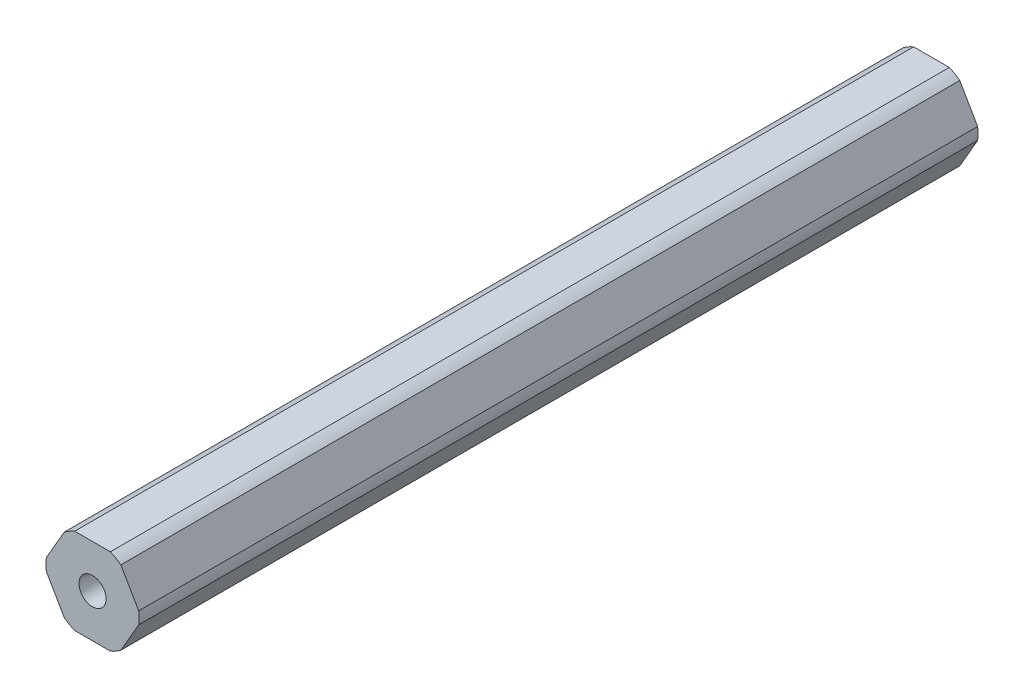
ISO-10303-21;
HEADER;
FILE_DESCRIPTION(('STEP AP214'),'2;1');
FILE_NAME('part.step','',(''),(''),'','','');
FILE_SCHEMA(('AUTOMOTIVE_DESIGN { 1 0 10303 214 1 1 1 1 }'));
ENDSEC;
DATA;
#1=APPLICATION_CONTEXT('core data for automotive mechanical design processes');
#2=APPLICATION_PROTOCOL_DEFINITION('international standard','automotive_design',2000,#1);
#3=PRODUCT_CONTEXT('',#1,'mechanical');
#4=PRODUCT('Part','Part','',(#3));
#5=PRODUCT_RELATED_PRODUCT_CATEGORY('part','',(#4));
#6=PRODUCT_DEFINITION_FORMATION('','',#4);
#7=PRODUCT_DEFINITION_CONTEXT('part definition',#1,'design');
#8=PRODUCT_DEFINITION('design','',#6,#7);
#9=PRODUCT_DEFINITION_SHAPE('','',#8);
#10=(LENGTH_UNIT() NAMED_UNIT(*) SI_UNIT(.MILLI.,.METRE.));
#11=(NAMED_UNIT(*) PLANE_ANGLE_UNIT() SI_UNIT($,.RADIAN.));
#12=(NAMED_UNIT(*) SI_UNIT($,.STERADIAN.) SOLID_ANGLE_UNIT());
#13=UNCERTAINTY_MEASURE_WITH_UNIT(LENGTH_MEASURE(1.E-05),#10,'distance_accuracy_value','');
#14=(GEOMETRIC_REPRESENTATION_CONTEXT(3) GLOBAL_UNCERTAINTY_ASSIGNED_CONTEXT((#13)) GLOBAL_UNIT_ASSIGNED_CONTEXT((#10,
#11,#12)) REPRESENTATION_CONTEXT('',''));
#15=CARTESIAN_POINT('',(0.,0.,0.));
#16=DIRECTION('',(0.,0.,1.));
#17=DIRECTION('',(1.,0.,0.));
#18=AXIS2_PLACEMENT_3D('',#15,#16,#17);
#19=CARTESIAN_POINT('',(5.49926131403118,3.175,61.9125));
#20=DIRECTION('',(-0.866025403784438,-0.5,0.));
#21=DIRECTION('',(0.5,-0.866025403784439,0.));
#22=AXIS2_PLACEMENT_3D('',#19,#20,#21);
#23=PLANE('',#22);
#24=DIRECTION('',(-0.5,0.866025403784439,0.));
#25=VECTOR('',#24,1.);
#26=CARTESIAN_POINT('',(5.49926131403118,3.175,-61.9125));
#27=LINE('',#26,#25);
#28=CARTESIAN_POINT('',(6.81675178197583,0.89303957103218,-61.9125));
#29=VERTEX_POINT('',#28);
#30=CARTESIAN_POINT('',(4.18177084608654,5.45696042896782,-61.9125));
#31=VERTEX_POINT('',#30);
#32=EDGE_CURVE('E164',#29,#31,#27,.T.);
#33=ORIENTED_EDGE('',*,*,#32,.T.);
#34=DIRECTION('',(0.,0.,-1.));
#35=VECTOR('',#34,1.);
#36=CARTESIAN_POINT('',(4.18177084608654,5.45696042896782,61.9125));
#37=LINE('',#36,#35);
#38=CARTESIAN_POINT('',(4.18177084608654,5.45696042896782,61.9125));
#39=VERTEX_POINT('',#38);
#40=EDGE_CURVE('E11',#39,#31,#37,.T.);
#41=ORIENTED_EDGE('',*,*,#40,.F.);
#42=DIRECTION('',(-0.5,0.866025403784439,0.));
#43=VECTOR('',#42,1.);
#44=CARTESIAN_POINT('',(5.49926131403118,3.175,61.9125));
#45=LINE('',#44,#43);
#46=CARTESIAN_POINT('',(6.81675178197583,0.89303957103218,61.9125));
#47=VERTEX_POINT('',#46);
#48=EDGE_CURVE('E223',#47,#39,#45,.T.);
#49=ORIENTED_EDGE('',*,*,#48,.F.);
#50=DIRECTION('',(0.,0.,-1.));
#51=VECTOR('',#50,1.);
#52=CARTESIAN_POINT('',(6.81675178197583,0.89303957103218,61.9125));
#53=LINE('',#52,#51);
#54=EDGE_CURVE('E157',#47,#29,#53,.T.);
#55=ORIENTED_EDGE('',*,*,#54,.T.);
#56=EDGE_LOOP('',(#33,#41,#49,#55));
#57=FACE_BOUND('',#56,.T.);
#58=ADVANCED_FACE('F39',(#57),#23,.F.);
#59=CARTESIAN_POINT('',(0.,0.,61.9125));
#60=DIRECTION('',(0.,0.,-1.));
#61=DIRECTION('',(-1.,0.,0.));
#62=AXIS2_PLACEMENT_3D('',#59,#60,#61);
#63=CYLINDRICAL_SURFACE('',#62,6.874999966);
#64=CARTESIAN_POINT('',(0.,0.,-61.9125));
#65=DIRECTION('',(0.,0.,1.));
#66=DIRECTION('',(1.,0.,0.));
#67=AXIS2_PLACEMENT_3D('',#64,#65,#66);
#68=CIRCLE('',#67,6.874999966);
#69=CARTESIAN_POINT('',(2.63498093588929,6.35,-61.9125));
#70=VERTEX_POINT('',#69);
#71=EDGE_CURVE('E167',#31,#70,#68,.T.);
#72=ORIENTED_EDGE('',*,*,#71,.T.);
#73=DIRECTION('',(0.,0.,-1.));
#74=VECTOR('',#73,1.);
#75=CARTESIAN_POINT('',(2.63498093588929,6.35,61.9125));
#76=LINE('',#75,#74);
#77=CARTESIAN_POINT('',(2.63498093588929,6.35,61.9125));
#78=VERTEX_POINT('',#77);
#79=EDGE_CURVE('E48',#78,#70,#76,.T.);
#80=ORIENTED_EDGE('',*,*,#79,.F.);
#81=CARTESIAN_POINT('',(0.,0.,61.9125));
#82=DIRECTION('',(0.,0.,1.));
#83=DIRECTION('',(1.,0.,0.));
#84=AXIS2_PLACEMENT_3D('',#81,#82,#83);
#85=CIRCLE('',#84,6.874999966);
#86=EDGE_CURVE('E111',#39,#78,#85,.T.);
#87=ORIENTED_EDGE('',*,*,#86,.F.);
#88=ORIENTED_EDGE('',*,*,#40,.T.);
#89=EDGE_LOOP('',(#72,#80,#87,#88));
#90=FACE_BOUND('',#89,.T.);
#91=ADVANCED_FACE('F258',(#90),#63,.T.);
#92=CARTESIAN_POINT('',(0.,6.35,61.9125));
#93=DIRECTION('',(0.,-1.,0.));
#94=DIRECTION('',(0.,0.,-1.));
#95=AXIS2_PLACEMENT_3D('',#92,#93,#94);
#96=PLANE('',#95);
#97=DIRECTION('',(-1.,0.,0.));
#98=VECTOR('',#97,1.);
#99=CARTESIAN_POINT('',(0.,6.35,-61.9125));
#100=LINE('',#99,#98);
#101=CARTESIAN_POINT('',(-2.63498093588929,6.35,-61.9125));
#102=VERTEX_POINT('',#101);
#103=EDGE_CURVE('E169',#70,#102,#100,.T.);
#104=ORIENTED_EDGE('',*,*,#103,.T.);
#105=DIRECTION('',(0.,0.,-1.));
#106=VECTOR('',#105,1.);
#107=CARTESIAN_POINT('',(-2.63498093588929,6.35,61.9125));
#108=LINE('',#107,#106);
#109=CARTESIAN_POINT('',(-2.63498093588929,6.35,61.9125));
#110=VERTEX_POINT('',#109);
#111=EDGE_CURVE('E199',#110,#102,#108,.T.);
#112=ORIENTED_EDGE('',*,*,#111,.F.);
#113=DIRECTION('',(-1.,0.,0.));
#114=VECTOR('',#113,1.);
#115=CARTESIAN_POINT('',(0.,6.35,61.9125));
#116=LINE('',#115,#114);
#117=EDGE_CURVE('E207',#78,#110,#116,.T.);
#118=ORIENTED_EDGE('',*,*,#117,.F.);
#119=ORIENTED_EDGE('',*,*,#79,.T.);
#120=EDGE_LOOP('',(#104,#112,#118,#119));
#121=FACE_BOUND('',#120,.T.);
#122=ADVANCED_FACE('F205',(#121),#96,.F.);
#123=CARTESIAN_POINT('',(-4.18177084608654,5.45696042896783,-61.9125));
#124=VERTEX_POINT('',#123);
#125=EDGE_CURVE('E170',#102,#124,#68,.T.);
#126=ORIENTED_EDGE('',*,*,#125,.T.);
#127=DIRECTION('',(0.,0.,-1.));
#128=VECTOR('',#127,1.);
#129=CARTESIAN_POINT('',(-4.18177084608654,5.45696042896783,61.9125));
#130=LINE('',#129,#128);
#131=CARTESIAN_POINT('',(-4.18177084608654,5.45696042896783,61.9125));
#132=VERTEX_POINT('',#131);
#133=EDGE_CURVE('E196',#132,#124,#130,.T.);
#134=ORIENTED_EDGE('',*,*,#133,.F.);
#135=EDGE_CURVE('E229',#110,#132,#85,.T.);
#136=ORIENTED_EDGE('',*,*,#135,.F.);
#137=ORIENTED_EDGE('',*,*,#111,.T.);
#138=EDGE_LOOP('',(#126,#134,#136,#137));
#139=FACE_BOUND('',#138,.T.);
#140=ADVANCED_FACE('F240',(#139),#63,.T.);
#141=CARTESIAN_POINT('',(-5.49926131403118,3.175,61.9125));
#142=DIRECTION('',(0.866025403784438,-0.5,0.));
#143=DIRECTION('',(0.5,0.866025403784438,0.));
#144=AXIS2_PLACEMENT_3D('',#141,#142,#143);
#145=PLANE('',#144);
#146=DIRECTION('',(-0.5,-0.866025403784438,0.));
#147=VECTOR('',#146,1.);
#148=CARTESIAN_POINT('',(-5.49926131403118,3.175,-61.9125));
#149=LINE('',#148,#147);
#150=CARTESIAN_POINT('',(-6.81675178197583,0.893039571032178,-61.9125));
#151=VERTEX_POINT('',#150);
#152=EDGE_CURVE('E172',#124,#151,#149,.T.);
#153=ORIENTED_EDGE('',*,*,#152,.T.);
#154=DIRECTION('',(0.,0.,-1.));
#155=VECTOR('',#154,1.);
#156=CARTESIAN_POINT('',(-6.81675178197583,0.893039571032178,61.9125));
#157=LINE('',#156,#155);
#158=CARTESIAN_POINT('',(-6.81675178197583,0.893039571032178,61.9125));
#159=VERTEX_POINT('',#158);
#160=EDGE_CURVE('E193',#159,#151,#157,.T.);
#161=ORIENTED_EDGE('',*,*,#160,.F.);
#162=DIRECTION('',(-0.5,-0.866025403784438,0.));
#163=VECTOR('',#162,1.);
#164=CARTESIAN_POINT('',(-5.49926131403118,3.175,61.9125));
#165=LINE('',#164,#163);
#166=EDGE_CURVE('E231',#132,#159,#165,.T.);
#167=ORIENTED_EDGE('',*,*,#166,.F.);
#168=ORIENTED_EDGE('',*,*,#133,.T.);
#169=EDGE_LOOP('',(#153,#161,#167,#168));
#170=FACE_BOUND('',#169,.T.);
#171=ADVANCED_FACE('F242',(#170),#145,.F.);
#172=CARTESIAN_POINT('',(-6.81675178197583,-0.893039571032174,-61.9125));
#173=VERTEX_POINT('',#172);
#174=EDGE_CURVE('E174',#151,#173,#68,.T.);
#175=ORIENTED_EDGE('',*,*,#174,.T.);
#176=DIRECTION('',(0.,0.,-1.));
#177=VECTOR('',#176,1.);
#178=CARTESIAN_POINT('',(-6.81675178197583,-0.893039571032174,61.9125));
#179=LINE('',#178,#177);
#180=CARTESIAN_POINT('',(-6.81675178197583,-0.893039571032174,61.9125));
#181=VERTEX_POINT('',#180);
#182=EDGE_CURVE('E190',#181,#173,#179,.T.);
#183=ORIENTED_EDGE('',*,*,#182,.F.);
#184=EDGE_CURVE('E232',#159,#181,#85,.T.);
#185=ORIENTED_EDGE('',*,*,#184,.F.);
#186=ORIENTED_EDGE('',*,*,#160,.T.);
#187=EDGE_LOOP('',(#175,#183,#185,#186));
#188=FACE_BOUND('',#187,.T.);
#189=ADVANCED_FACE('F243',(#188),#63,.T.);
#190=CARTESIAN_POINT('',(-5.49926131403118,-3.175,61.9125));
#191=DIRECTION('',(0.866025403784438,0.5,0.));
#192=DIRECTION('',(-0.5,0.866025403784438,0.));
#193=AXIS2_PLACEMENT_3D('',#190,#191,#192);
#194=PLANE('',#193);
#195=DIRECTION('',(0.5,-0.866025403784438,0.));
#196=VECTOR('',#195,1.);
#197=CARTESIAN_POINT('',(-5.49926131403118,-3.175,-61.9125));
#198=LINE('',#197,#196);
#199=CARTESIAN_POINT('',(-4.18177084608653,-5.45696042896783,-61.9125));
#200=VERTEX_POINT('',#199);
#201=EDGE_CURVE('E175',#173,#200,#198,.T.);
#202=ORIENTED_EDGE('',*,*,#201,.T.);
#203=DIRECTION('',(0.,0.,-1.));
#204=VECTOR('',#203,1.);
#205=CARTESIAN_POINT('',(-4.18177084608653,-5.45696042896783,61.9125));
#206=LINE('',#205,#204);
#207=CARTESIAN_POINT('',(-4.18177084608653,-5.45696042896783,61.9125));
#208=VERTEX_POINT('',#207);
#209=EDGE_CURVE('E187',#208,#200,#206,.T.);
#210=ORIENTED_EDGE('',*,*,#209,.F.);
#211=DIRECTION('',(0.5,-0.866025403784438,0.));
#212=VECTOR('',#211,1.);
#213=CARTESIAN_POINT('',(-5.49926131403118,-3.175,61.9125));
#214=LINE('',#213,#212);
#215=EDGE_CURVE('E233',#181,#208,#214,.T.);
#216=ORIENTED_EDGE('',*,*,#215,.F.);
#217=ORIENTED_EDGE('',*,*,#182,.T.);
#218=EDGE_LOOP('',(#202,#210,#216,#217));
#219=FACE_BOUND('',#218,.T.);
#220=ADVANCED_FACE('F246',(#219),#194,.F.);
#221=CARTESIAN_POINT('',(-2.6349809358893,-6.35,-61.9125));
#222=VERTEX_POINT('',#221);
#223=EDGE_CURVE('E177',#200,#222,#68,.T.);
#224=ORIENTED_EDGE('',*,*,#223,.T.);
#225=DIRECTION('',(0.,0.,-1.));
#226=VECTOR('',#225,1.);
#227=CARTESIAN_POINT('',(-2.6349809358893,-6.35,61.9125));
#228=LINE('',#227,#226);
#229=CARTESIAN_POINT('',(-2.6349809358893,-6.35,61.9125));
#230=VERTEX_POINT('',#229);
#231=EDGE_CURVE('E184',#230,#222,#228,.T.);
#232=ORIENTED_EDGE('',*,*,#231,.F.);
#233=EDGE_CURVE('E147',#208,#230,#85,.T.);
#234=ORIENTED_EDGE('',*,*,#233,.F.);
#235=ORIENTED_EDGE('',*,*,#209,.T.);
#236=EDGE_LOOP('',(#224,#232,#234,#235));
#237=FACE_BOUND('',#236,.T.);
#238=ADVANCED_FACE('F248',(#237),#63,.T.);
#239=CARTESIAN_POINT('',(0.,-6.35,61.9125));
#240=DIRECTION('',(0.,1.,0.));
#241=DIRECTION('',(0.,0.,1.));
#242=AXIS2_PLACEMENT_3D('',#239,#240,#241);
#243=PLANE('',#242);
#244=DIRECTION('',(1.,0.,0.));
#245=VECTOR('',#244,1.);
#246=CARTESIAN_POINT('',(0.,-6.35,-61.9125));
#247=LINE('',#246,#245);
#248=CARTESIAN_POINT('',(2.6349809358893,-6.35,-61.9125));
#249=VERTEX_POINT('',#248);
#250=EDGE_CURVE('E178',#222,#249,#247,.T.);
#251=ORIENTED_EDGE('',*,*,#250,.T.);
#252=DIRECTION('',(0.,0.,-1.));
#253=VECTOR('',#252,1.);
#254=CARTESIAN_POINT('',(2.6349809358893,-6.35,61.9125));
#255=LINE('',#254,#253);
#256=CARTESIAN_POINT('',(2.6349809358893,-6.35,61.9125));
#257=VERTEX_POINT('',#256);
#258=EDGE_CURVE('E152',#257,#249,#255,.T.);
#259=ORIENTED_EDGE('',*,*,#258,.F.);
#260=DIRECTION('',(1.,0.,0.));
#261=VECTOR('',#260,1.);
#262=CARTESIAN_POINT('',(0.,-6.35,61.9125));
#263=LINE('',#262,#261);
#264=EDGE_CURVE('E142',#230,#257,#263,.T.);
#265=ORIENTED_EDGE('',*,*,#264,.F.);
#266=ORIENTED_EDGE('',*,*,#231,.T.);
#267=EDGE_LOOP('',(#251,#259,#265,#266));
#268=FACE_BOUND('',#267,.T.);
#269=ADVANCED_FACE('F251',(#268),#243,.F.);
#270=CARTESIAN_POINT('',(4.18177084608654,-5.45696042896782,-61.9125));
#271=VERTEX_POINT('',#270);
#272=EDGE_CURVE('E151',#249,#271,#68,.T.);
#273=ORIENTED_EDGE('',*,*,#272,.T.);
#274=DIRECTION('',(0.,0.,-1.));
#275=VECTOR('',#274,1.);
#276=CARTESIAN_POINT('',(4.18177084608654,-5.45696042896782,61.9125));
#277=LINE('',#276,#275);
#278=CARTESIAN_POINT('',(4.18177084608654,-5.45696042896782,61.9125));
#279=VERTEX_POINT('',#278);
#280=EDGE_CURVE('E148',#279,#271,#277,.T.);
#281=ORIENTED_EDGE('',*,*,#280,.F.);
#282=EDGE_CURVE('E136',#257,#279,#85,.T.);
#283=ORIENTED_EDGE('',*,*,#282,.F.);
#284=ORIENTED_EDGE('',*,*,#258,.T.);
#285=EDGE_LOOP('',(#273,#281,#283,#284));
#286=FACE_BOUND('',#285,.T.);
#287=ADVANCED_FACE('F149',(#286),#63,.T.);
#288=CARTESIAN_POINT('',(5.49926131403119,-3.175,61.9125));
#289=DIRECTION('',(-0.866025403784439,0.5,0.));
#290=DIRECTION('',(-0.5,-0.866025403784439,0.));
#291=AXIS2_PLACEMENT_3D('',#288,#289,#290);
#292=PLANE('',#291);
#293=DIRECTION('',(0.5,0.866025403784439,0.));
#294=VECTOR('',#293,1.);
#295=CARTESIAN_POINT('',(5.49926131403119,-3.175,-61.9125));
#296=LINE('',#295,#294);
#297=CARTESIAN_POINT('',(6.81675178197583,-0.893039571032182,-61.9125));
#298=VERTEX_POINT('',#297);
#299=EDGE_CURVE('E97',#271,#298,#296,.T.);
#300=ORIENTED_EDGE('',*,*,#299,.T.);
#301=DIRECTION('',(0.,0.,-1.));
#302=VECTOR('',#301,1.);
#303=CARTESIAN_POINT('',(6.81675178197583,-0.893039571032182,61.9125));
#304=LINE('',#303,#302);
#305=CARTESIAN_POINT('',(6.81675178197583,-0.893039571032182,61.9125));
#306=VERTEX_POINT('',#305);
#307=EDGE_CURVE('E153',#306,#298,#304,.T.);
#308=ORIENTED_EDGE('',*,*,#307,.F.);
#309=DIRECTION('',(0.5,0.866025403784439,0.));
#310=VECTOR('',#309,1.);
#311=CARTESIAN_POINT('',(5.49926131403119,-3.175,61.9125));
#312=LINE('',#311,#310);
#313=EDGE_CURVE('E140',#279,#306,#312,.T.);
#314=ORIENTED_EDGE('',*,*,#313,.F.);
#315=ORIENTED_EDGE('',*,*,#280,.T.);
#316=EDGE_LOOP('',(#300,#308,#314,#315));
#317=FACE_BOUND('',#316,.T.);
#318=ADVANCED_FACE('F155',(#317),#292,.F.);
#319=CARTESIAN_POINT('',(0.,0.,61.9125));
#320=DIRECTION('',(0.,0.,-1.));
#321=DIRECTION('',(-1.,0.,0.));
#322=AXIS2_PLACEMENT_3D('',#319,#320,#321);
#323=CYLINDRICAL_SURFACE('',#322,2.000000064);
#324=CARTESIAN_POINT('',(0.,0.,61.9125));
#325=DIRECTION('',(0.,0.,1.));
#326=DIRECTION('',(1.,0.,0.));
#327=AXIS2_PLACEMENT_3D('',#324,#325,#326);
#328=CIRCLE('',#327,2.000000064);
#329=CARTESIAN_POINT('',(2.000000064,0.,61.9125));
#330=VERTEX_POINT('',#329);
#331=EDGE_CURVE('E221',#330,#330,#328,.T.);
#332=ORIENTED_EDGE('',*,*,#331,.T.);
#333=EDGE_LOOP('',(#332));
#334=FACE_BOUND('',#333,.T.);
#335=CARTESIAN_POINT('',(0.,0.,-61.9125));
#336=DIRECTION('',(0.,0.,1.));
#337=DIRECTION('',(1.,0.,0.));
#338=AXIS2_PLACEMENT_3D('',#335,#336,#337);
#339=CIRCLE('',#338,2.000000064);
#340=CARTESIAN_POINT('',(2.000000064,0.,-61.9125));
#341=VERTEX_POINT('',#340);
#342=EDGE_CURVE('E161',#341,#341,#339,.T.);
#343=ORIENTED_EDGE('',*,*,#342,.F.);
#344=EDGE_LOOP('',(#343));
#345=FACE_BOUND('',#344,.T.);
#346=ADVANCED_FACE('F41',(#334,#345),#323,.F.);
#347=EDGE_CURVE('E103',#298,#29,#68,.T.);
#348=ORIENTED_EDGE('',*,*,#347,.T.);
#349=ORIENTED_EDGE('',*,*,#54,.F.);
#350=EDGE_CURVE('E56',#306,#47,#85,.T.);
#351=ORIENTED_EDGE('',*,*,#350,.F.);
#352=ORIENTED_EDGE('',*,*,#307,.T.);
#353=EDGE_LOOP('',(#348,#349,#351,#352));
#354=FACE_BOUND('',#353,.T.);
#355=ADVANCED_FACE('F255',(#354),#63,.T.);
#356=CARTESIAN_POINT('',(0.,0.,61.9125));
#357=DIRECTION('',(0.,0.,1.));
#358=DIRECTION('',(1.,0.,0.));
#359=AXIS2_PLACEMENT_3D('',#356,#357,#358);
#360=PLANE('',#359);
#361=ORIENTED_EDGE('',*,*,#331,.F.);
#362=EDGE_LOOP('',(#361));
#363=FACE_BOUND('',#362,.T.);
#364=ORIENTED_EDGE('',*,*,#48,.T.);
#365=ORIENTED_EDGE('',*,*,#86,.T.);
#366=ORIENTED_EDGE('',*,*,#117,.T.);
#367=ORIENTED_EDGE('',*,*,#135,.T.);
#368=ORIENTED_EDGE('',*,*,#166,.T.);
#369=ORIENTED_EDGE('',*,*,#184,.T.);
#370=ORIENTED_EDGE('',*,*,#215,.T.);
#371=ORIENTED_EDGE('',*,*,#233,.T.);
#372=ORIENTED_EDGE('',*,*,#264,.T.);
#373=ORIENTED_EDGE('',*,*,#282,.T.);
#374=ORIENTED_EDGE('',*,*,#313,.T.);
#375=ORIENTED_EDGE('',*,*,#350,.T.);
#376=EDGE_LOOP('',(#364,#365,#366,#367,#368,#369,#370,#371,#372,#373,#374,#375));
#377=FACE_BOUND('',#376,.T.);
#378=ADVANCED_FACE('F138',(#363,#377),#360,.T.);
#379=CARTESIAN_POINT('',(0.,0.,-61.9125));
#380=DIRECTION('',(0.,0.,1.));
#381=DIRECTION('',(1.,0.,0.));
#382=AXIS2_PLACEMENT_3D('',#379,#380,#381);
#383=PLANE('',#382);
#384=ORIENTED_EDGE('',*,*,#342,.T.);
#385=EDGE_LOOP('',(#384));
#386=FACE_BOUND('',#385,.T.);
#387=ORIENTED_EDGE('',*,*,#32,.F.);
#388=ORIENTED_EDGE('',*,*,#347,.F.);
#389=ORIENTED_EDGE('',*,*,#299,.F.);
#390=ORIENTED_EDGE('',*,*,#272,.F.);
#391=ORIENTED_EDGE('',*,*,#250,.F.);
#392=ORIENTED_EDGE('',*,*,#223,.F.);
#393=ORIENTED_EDGE('',*,*,#201,.F.);
#394=ORIENTED_EDGE('',*,*,#174,.F.);
#395=ORIENTED_EDGE('',*,*,#152,.F.);
#396=ORIENTED_EDGE('',*,*,#125,.F.);
#397=ORIENTED_EDGE('',*,*,#103,.F.);
#398=ORIENTED_EDGE('',*,*,#71,.F.);
#399=EDGE_LOOP('',(#387,#388,#389,#390,#391,#392,#393,#394,#395,#396,#397,#398));
#400=FACE_BOUND('',#399,.T.);
#401=ADVANCED_FACE('F211',(#386,#400),#383,.F.);
#402=CLOSED_SHELL('',(#58,#91,#122,#140,#171,#189,#220,#238,#269,#287,#318,#346,#355,#378,#401));
#403=MANIFOLD_SOLID_BREP('B2',#402);
#404=ADVANCED_BREP_SHAPE_REPRESENTATION('',(#18,#403),#14);
#405=SHAPE_DEFINITION_REPRESENTATION(#9,#404);
ENDSEC;
END-ISO-10303-21;
